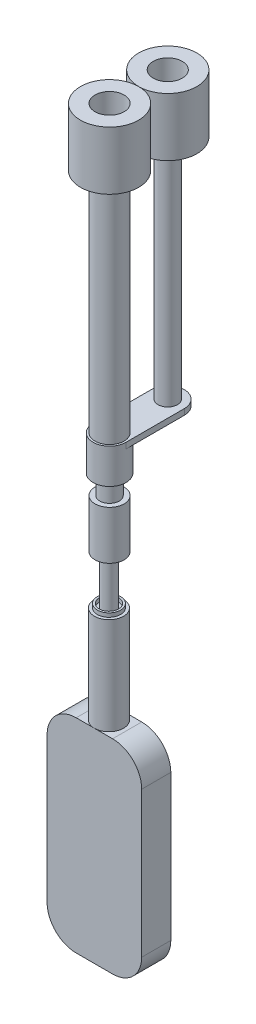
ISO-10303-21;
HEADER;
FILE_DESCRIPTION(('STEP AP214'),'2;1');
FILE_NAME('part.step','',(''),(''),'','','');
FILE_SCHEMA(('AUTOMOTIVE_DESIGN { 1 0 10303 214 1 1 1 1 }'));
ENDSEC;
DATA;
#1=APPLICATION_CONTEXT('core data for automotive mechanical design processes');
#2=APPLICATION_PROTOCOL_DEFINITION('international standard','automotive_design',2000,#1);
#3=PRODUCT_CONTEXT('',#1,'mechanical');
#4=PRODUCT('Part','Part','',(#3));
#5=PRODUCT_RELATED_PRODUCT_CATEGORY('part','',(#4));
#6=PRODUCT_DEFINITION_FORMATION('','',#4);
#7=PRODUCT_DEFINITION_CONTEXT('part definition',#1,'design');
#8=PRODUCT_DEFINITION('design','',#6,#7);
#9=PRODUCT_DEFINITION_SHAPE('','',#8);
#10=(LENGTH_UNIT() NAMED_UNIT(*) SI_UNIT(.MILLI.,.METRE.));
#11=(NAMED_UNIT(*) PLANE_ANGLE_UNIT() SI_UNIT($,.RADIAN.));
#12=(NAMED_UNIT(*) SI_UNIT($,.STERADIAN.) SOLID_ANGLE_UNIT());
#13=UNCERTAINTY_MEASURE_WITH_UNIT(LENGTH_MEASURE(1.E-05),#10,'distance_accuracy_value','');
#14=(GEOMETRIC_REPRESENTATION_CONTEXT(3) GLOBAL_UNCERTAINTY_ASSIGNED_CONTEXT((#13)) GLOBAL_UNIT_ASSIGNED_CONTEXT((#10,
#11,#12)) REPRESENTATION_CONTEXT('',''));
#15=CARTESIAN_POINT('',(0.,0.,0.));
#16=DIRECTION('',(0.,0.,1.));
#17=DIRECTION('',(1.,0.,0.));
#18=AXIS2_PLACEMENT_3D('',#15,#16,#17);
#19=CARTESIAN_POINT('',(0.,327.5,0.));
#20=DIRECTION('',(0.,1.,0.));
#21=DIRECTION('',(0.,0.,-1.));
#22=AXIS2_PLACEMENT_3D('',#19,#20,#21);
#23=PLANE('',#22);
#24=CARTESIAN_POINT('',(0.,327.5,-35.3070978727305));
#25=DIRECTION('',(0.,-1.,0.));
#26=DIRECTION('',(0.,0.,-1.));
#27=AXIS2_PLACEMENT_3D('',#24,#25,#26);
#28=CIRCLE('',#27,7.5);
#29=CARTESIAN_POINT('',(0.,327.5,-42.8070978727305));
#30=VERTEX_POINT('',#29);
#31=EDGE_CURVE('E59',#30,#30,#28,.T.);
#32=ORIENTED_EDGE('',*,*,#31,.T.);
#33=EDGE_LOOP('',(#32));
#34=FACE_BOUND('',#33,.T.);
#35=CARTESIAN_POINT('',(0.,327.5,-35.3070978727305));
#36=DIRECTION('',(0.,-1.,0.));
#37=DIRECTION('',(0.,0.,-1.));
#38=AXIS2_PLACEMENT_3D('',#35,#36,#37);
#39=CIRCLE('',#38,15.);
#40=CARTESIAN_POINT('',(0.,327.5,-50.3070978727305));
#41=VERTEX_POINT('',#40);
#42=EDGE_CURVE('E11',#41,#41,#39,.T.);
#43=ORIENTED_EDGE('',*,*,#42,.F.);
#44=EDGE_LOOP('',(#43));
#45=FACE_BOUND('',#44,.T.);
#46=ADVANCED_FACE('F46',(#34,#45),#23,.T.);
#47=CARTESIAN_POINT('',(0.,327.5,-35.3070978727305));
#48=DIRECTION('',(0.,-1.,0.));
#49=DIRECTION('',(1.,0.,0.));
#50=AXIS2_PLACEMENT_3D('',#47,#48,#49);
#51=CYLINDRICAL_SURFACE('',#50,15.);
#52=CARTESIAN_POINT('',(0.,297.5,-35.3070978727305));
#53=DIRECTION('',(0.,-1.,0.));
#54=DIRECTION('',(0.,0.,-1.));
#55=AXIS2_PLACEMENT_3D('',#52,#53,#54);
#56=CIRCLE('',#55,15.);
#57=CARTESIAN_POINT('',(0.,297.5,-50.3070978727305));
#58=VERTEX_POINT('',#57);
#59=EDGE_CURVE('E50',#58,#58,#56,.T.);
#60=ORIENTED_EDGE('',*,*,#59,.F.);
#61=EDGE_LOOP('',(#60));
#62=FACE_BOUND('',#61,.T.);
#63=ORIENTED_EDGE('',*,*,#42,.T.);
#64=EDGE_LOOP('',(#63));
#65=FACE_BOUND('',#64,.T.);
#66=ADVANCED_FACE('F48',(#62,#65),#51,.T.);
#67=CARTESIAN_POINT('',(0.,297.5,0.));
#68=DIRECTION('',(0.,1.,0.));
#69=DIRECTION('',(0.,0.,-1.));
#70=AXIS2_PLACEMENT_3D('',#67,#68,#69);
#71=PLANE('',#70);
#72=CARTESIAN_POINT('',(0.,297.5,-35.3070978727305));
#73=DIRECTION('',(0.,-1.,0.));
#74=DIRECTION('',(0.,0.,-1.));
#75=AXIS2_PLACEMENT_3D('',#72,#73,#74);
#76=CIRCLE('',#75,7.5);
#77=CARTESIAN_POINT('',(0.,297.5,-42.8070978727305));
#78=VERTEX_POINT('',#77);
#79=EDGE_CURVE('E57',#78,#78,#76,.T.);
#80=ORIENTED_EDGE('',*,*,#79,.F.);
#81=EDGE_LOOP('',(#80));
#82=FACE_BOUND('',#81,.T.);
#83=ORIENTED_EDGE('',*,*,#59,.T.);
#84=EDGE_LOOP('',(#83));
#85=FACE_BOUND('',#84,.T.);
#86=ADVANCED_FACE('F68',(#82,#85),#71,.F.);
#87=CARTESIAN_POINT('',(0.,297.5,-35.3070978727305));
#88=DIRECTION('',(0.,1.,0.));
#89=DIRECTION('',(0.,0.,-1.));
#90=AXIS2_PLACEMENT_3D('',#87,#88,#89);
#91=CYLINDRICAL_SURFACE('',#90,7.5);
#92=ORIENTED_EDGE('',*,*,#79,.T.);
#93=EDGE_LOOP('',(#92));
#94=FACE_BOUND('',#93,.T.);
#95=ORIENTED_EDGE('',*,*,#31,.F.);
#96=EDGE_LOOP('',(#95));
#97=FACE_BOUND('',#96,.T.);
#98=ADVANCED_FACE('F65',(#94,#97),#91,.F.);
#99=CLOSED_SHELL('',(#46,#66,#86,#98));
#100=MANIFOLD_SOLID_BREP('B2',#99);
#101=CARTESIAN_POINT('',(0.,102.5,-5.));
#102=DIRECTION('',(0.,1.,0.));
#103=DIRECTION('',(-1.,0.,0.));
#104=AXIS2_PLACEMENT_3D('',#101,#102,#103);
#105=PLANE('',#104);
#106=CARTESIAN_POINT('',(0.,102.5,-5.));
#107=DIRECTION('',(0.,-1.,0.));
#108=DIRECTION('',(-1.,0.,0.));
#109=AXIS2_PLACEMENT_3D('',#106,#107,#108);
#110=CIRCLE('',#109,3.5);
#111=CARTESIAN_POINT('',(-3.50000000000002,102.5,-5.));
#112=VERTEX_POINT('',#111);
#113=EDGE_CURVE('E323',#112,#112,#110,.T.);
#114=ORIENTED_EDGE('',*,*,#113,.T.);
#115=EDGE_LOOP('',(#114));
#116=FACE_BOUND('',#115,.T.);
#117=CARTESIAN_POINT('',(0.,102.5,-5.));
#118=DIRECTION('',(0.,-1.,0.));
#119=DIRECTION('',(-1.,0.,0.));
#120=AXIS2_PLACEMENT_3D('',#117,#118,#119);
#121=CIRCLE('',#120,5.);
#122=CARTESIAN_POINT('',(-5.00000000000002,102.5,-5.));
#123=VERTEX_POINT('',#122);
#124=EDGE_CURVE('E247',#123,#123,#121,.F.);
#125=ORIENTED_EDGE('',*,*,#124,.T.);
#126=EDGE_LOOP('',(#125));
#127=FACE_BOUND('',#126,.T.);
#128=ADVANCED_FACE('F115',(#116,#127),#105,.T.);
#129=CARTESIAN_POINT('',(0.,127.5,-5.));
#130=DIRECTION('',(0.,-1.,0.));
#131=DIRECTION('',(1.,0.,0.));
#132=AXIS2_PLACEMENT_3D('',#129,#130,#131);
#133=CYLINDRICAL_SURFACE('',#132,3.5);
#134=CARTESIAN_POINT('',(0.,127.5,-5.));
#135=DIRECTION('',(0.,-1.,0.));
#136=DIRECTION('',(-1.,0.,0.));
#137=AXIS2_PLACEMENT_3D('',#134,#135,#136);
#138=CIRCLE('',#137,3.5);
#139=CARTESIAN_POINT('',(-3.50000000000003,127.5,-5.));
#140=VERTEX_POINT('',#139);
#141=EDGE_CURVE('E327',#140,#140,#138,.T.);
#142=ORIENTED_EDGE('',*,*,#141,.T.);
#143=EDGE_LOOP('',(#142));
#144=FACE_BOUND('',#143,.T.);
#145=ORIENTED_EDGE('',*,*,#113,.F.);
#146=EDGE_LOOP('',(#145));
#147=FACE_BOUND('',#146,.T.);
#148=ADVANCED_FACE('F380',(#144,#147),#133,.T.);
#149=CARTESIAN_POINT('',(0.,152.5,-5.30709787273054));
#150=DIRECTION('',(0.,-1.,0.));
#151=DIRECTION('',(1.,0.,0.));
#152=AXIS2_PLACEMENT_3D('',#149,#150,#151);
#153=CYLINDRICAL_SURFACE('',#152,7.5);
#154=CARTESIAN_POINT('',(0.,152.5,-5.30709787273054));
#155=DIRECTION('',(0.,-1.,0.));
#156=DIRECTION('',(-1.,0.,0.));
#157=AXIS2_PLACEMENT_3D('',#154,#155,#156);
#158=CIRCLE('',#157,7.5);
#159=CARTESIAN_POINT('',(-7.50000000000003,152.5,-5.30709787273054));
#160=VERTEX_POINT('',#159);
#161=EDGE_CURVE('E331',#160,#160,#158,.T.);
#162=ORIENTED_EDGE('',*,*,#161,.T.);
#163=EDGE_LOOP('',(#162));
#164=FACE_BOUND('',#163,.T.);
#165=CARTESIAN_POINT('',(0.,127.5,-5.30709787273054));
#166=DIRECTION('',(0.,-1.,0.));
#167=DIRECTION('',(-1.,0.,0.));
#168=AXIS2_PLACEMENT_3D('',#165,#166,#167);
#169=CIRCLE('',#168,7.5);
#170=CARTESIAN_POINT('',(-7.50000000000003,127.5,-5.30709787273054));
#171=VERTEX_POINT('',#170);
#172=EDGE_CURVE('E326',#171,#171,#169,.T.);
#173=ORIENTED_EDGE('',*,*,#172,.F.);
#174=EDGE_LOOP('',(#173));
#175=FACE_BOUND('',#174,.T.);
#176=ADVANCED_FACE('F387',(#164,#175),#153,.T.);
#177=CARTESIAN_POINT('',(0.,152.5,-5.30709787273054));
#178=DIRECTION('',(0.,1.,0.));
#179=DIRECTION('',(-1.,0.,0.));
#180=AXIS2_PLACEMENT_3D('',#177,#178,#179);
#181=PLANE('',#180);
#182=CARTESIAN_POINT('',(0.,152.5,-5.30709787273054));
#183=DIRECTION('',(0.,-1.,0.));
#184=DIRECTION('',(-1.,0.,0.));
#185=AXIS2_PLACEMENT_3D('',#182,#183,#184);
#186=CIRCLE('',#185,5.);
#187=CARTESIAN_POINT('',(-5.00000000000003,152.5,-5.30709787273054));
#188=VERTEX_POINT('',#187);
#189=EDGE_CURVE('E330',#188,#188,#186,.T.);
#190=ORIENTED_EDGE('',*,*,#189,.T.);
#191=EDGE_LOOP('',(#190));
#192=FACE_BOUND('',#191,.T.);
#193=ORIENTED_EDGE('',*,*,#161,.F.);
#194=EDGE_LOOP('',(#193));
#195=FACE_BOUND('',#194,.T.);
#196=ADVANCED_FACE('F660',(#192,#195),#181,.T.);
#197=CARTESIAN_POINT('',(0.,127.5,-5.30709787273054));
#198=DIRECTION('',(0.,1.,0.));
#199=DIRECTION('',(-1.,0.,0.));
#200=AXIS2_PLACEMENT_3D('',#197,#198,#199);
#201=PLANE('',#200);
#202=ORIENTED_EDGE('',*,*,#141,.F.);
#203=EDGE_LOOP('',(#202));
#204=FACE_BOUND('',#203,.T.);
#205=ORIENTED_EDGE('',*,*,#172,.T.);
#206=EDGE_LOOP('',(#205));
#207=FACE_BOUND('',#206,.T.);
#208=ADVANCED_FACE('F652',(#204,#207),#201,.F.);
#209=CARTESIAN_POINT('',(0.,162.5,-5.30709787273054));
#210=DIRECTION('',(0.,-1.,0.));
#211=DIRECTION('',(1.,0.,0.));
#212=AXIS2_PLACEMENT_3D('',#209,#210,#211);
#213=CYLINDRICAL_SURFACE('',#212,5.);
#214=CARTESIAN_POINT('',(0.,162.5,-5.30709787273054));
#215=DIRECTION('',(0.,-1.,0.));
#216=DIRECTION('',(-1.,0.,0.));
#217=AXIS2_PLACEMENT_3D('',#214,#215,#216);
#218=CIRCLE('',#217,5.);
#219=CARTESIAN_POINT('',(-5.00000000000003,162.5,-5.30709787273054));
#220=VERTEX_POINT('',#219);
#221=EDGE_CURVE('E339',#220,#220,#218,.T.);
#222=ORIENTED_EDGE('',*,*,#221,.T.);
#223=EDGE_LOOP('',(#222));
#224=FACE_BOUND('',#223,.T.);
#225=ORIENTED_EDGE('',*,*,#189,.F.);
#226=EDGE_LOOP('',(#225));
#227=FACE_BOUND('',#226,.T.);
#228=ADVANCED_FACE('F646',(#224,#227),#213,.T.);
#229=CARTESIAN_POINT('',(0.,177.5,-5.30709787273054));
#230=DIRECTION('',(0.,-1.,0.));
#231=DIRECTION('',(1.,0.,0.));
#232=AXIS2_PLACEMENT_3D('',#229,#230,#231);
#233=CYLINDRICAL_SURFACE('',#232,8.5);
#234=CARTESIAN_POINT('',(0.,177.5,-5.30709787273054));
#235=DIRECTION('',(0.,-1.,0.));
#236=DIRECTION('',(-1.,0.,0.));
#237=AXIS2_PLACEMENT_3D('',#234,#235,#236);
#238=CIRCLE('',#237,8.5);
#239=CARTESIAN_POINT('',(-8.50000000000004,177.5,-5.30709787273054));
#240=VERTEX_POINT('',#239);
#241=CARTESIAN_POINT('',(8.49999999999996,177.5,-5.30709787273052));
#242=VERTEX_POINT('',#241);
#243=EDGE_CURVE('E244',#240,#242,#238,.T.);
#244=ORIENTED_EDGE('',*,*,#243,.T.);
#245=DIRECTION('',(0.,-1.,0.));
#246=VECTOR('',#245,1.);
#247=CARTESIAN_POINT('',(8.49999999999996,180.5,-5.30709787273054));
#248=LINE('',#247,#246);
#249=CARTESIAN_POINT('',(8.49999999999996,180.5,-5.30709787273054));
#250=VERTEX_POINT('',#249);
#251=EDGE_CURVE('E338',#250,#242,#248,.T.);
#252=ORIENTED_EDGE('',*,*,#251,.F.);
#253=CARTESIAN_POINT('',(0.,180.5,-5.30709787273054));
#254=DIRECTION('',(0.,-1.,0.));
#255=DIRECTION('',(0.,0.,-1.));
#256=AXIS2_PLACEMENT_3D('',#253,#254,#255);
#257=CIRCLE('',#256,8.5);
#258=CARTESIAN_POINT('',(-8.50000000000004,180.5,-5.30709787273054));
#259=VERTEX_POINT('',#258);
#260=EDGE_CURVE('E229',#250,#259,#257,.T.);
#261=ORIENTED_EDGE('',*,*,#260,.T.);
#262=DIRECTION('',(0.,-1.,0.));
#263=VECTOR('',#262,1.);
#264=CARTESIAN_POINT('',(-8.50000000000004,180.5,-5.30709787273054));
#265=LINE('',#264,#263);
#266=EDGE_CURVE('E227',#259,#240,#265,.T.);
#267=ORIENTED_EDGE('',*,*,#266,.T.);
#268=EDGE_LOOP('',(#244,#252,#261,#267));
#269=FACE_BOUND('',#268,.T.);
#270=CARTESIAN_POINT('',(0.,162.5,-5.30709787273054));
#271=DIRECTION('',(0.,-1.,0.));
#272=DIRECTION('',(-1.,0.,0.));
#273=AXIS2_PLACEMENT_3D('',#270,#271,#272);
#274=CIRCLE('',#273,8.5);
#275=CARTESIAN_POINT('',(-8.50000000000004,162.5,-5.30709787273054));
#276=VERTEX_POINT('',#275);
#277=EDGE_CURVE('E343',#276,#276,#274,.T.);
#278=ORIENTED_EDGE('',*,*,#277,.F.);
#279=EDGE_LOOP('',(#278));
#280=FACE_BOUND('',#279,.T.);
#281=ADVANCED_FACE('F364',(#269,#280),#233,.T.);
#282=CARTESIAN_POINT('',(0.,162.5,-5.30709787273054));
#283=DIRECTION('',(0.,1.,0.));
#284=DIRECTION('',(-1.,0.,0.));
#285=AXIS2_PLACEMENT_3D('',#282,#283,#284);
#286=PLANE('',#285);
#287=ORIENTED_EDGE('',*,*,#221,.F.);
#288=EDGE_LOOP('',(#287));
#289=FACE_BOUND('',#288,.T.);
#290=ORIENTED_EDGE('',*,*,#277,.T.);
#291=EDGE_LOOP('',(#290));
#292=FACE_BOUND('',#291,.T.);
#293=ADVANCED_FACE('F608',(#289,#292),#286,.F.);
#294=CARTESIAN_POINT('',(0.,104.5,-5.));
#295=DIRECTION('',(0.,1.,0.));
#296=DIRECTION('',(-1.,0.,0.));
#297=AXIS2_PLACEMENT_3D('',#294,#295,#296);
#298=PLANE('',#297);
#299=CARTESIAN_POINT('',(0.,104.5,-5.));
#300=DIRECTION('',(0.,-1.,0.));
#301=DIRECTION('',(-1.,0.,0.));
#302=AXIS2_PLACEMENT_3D('',#299,#300,#301);
#303=CIRCLE('',#302,6.);
#304=CARTESIAN_POINT('',(-6.00000000000002,104.5,-5.));
#305=VERTEX_POINT('',#304);
#306=EDGE_CURVE('E342',#305,#305,#303,.T.);
#307=ORIENTED_EDGE('',*,*,#306,.F.);
#308=EDGE_LOOP('',(#307));
#309=FACE_BOUND('',#308,.T.);
#310=CARTESIAN_POINT('',(0.,104.5,-5.));
#311=DIRECTION('',(0.,-1.,0.));
#312=DIRECTION('',(-1.,0.,0.));
#313=AXIS2_PLACEMENT_3D('',#310,#311,#312);
#314=CIRCLE('',#313,5.);
#315=CARTESIAN_POINT('',(-5.00000000000002,104.5,-5.));
#316=VERTEX_POINT('',#315);
#317=EDGE_CURVE('E251',#316,#316,#314,.T.);
#318=ORIENTED_EDGE('',*,*,#317,.T.);
#319=EDGE_LOOP('',(#318));
#320=FACE_BOUND('',#319,.T.);
#321=ADVANCED_FACE('F614',(#309,#320),#298,.T.);
#322=CARTESIAN_POINT('',(0.,104.5,-5.));
#323=DIRECTION('',(0.,-1.,0.));
#324=DIRECTION('',(1.,0.,0.));
#325=AXIS2_PLACEMENT_3D('',#322,#323,#324);
#326=CYLINDRICAL_SURFACE('',#325,6.);
#327=ORIENTED_EDGE('',*,*,#306,.T.);
#328=EDGE_LOOP('',(#327));
#329=FACE_BOUND('',#328,.T.);
#330=CARTESIAN_POINT('',(0.,102.5,-5.));
#331=DIRECTION('',(0.,-1.,0.));
#332=DIRECTION('',(-1.,0.,0.));
#333=AXIS2_PLACEMENT_3D('',#330,#331,#332);
#334=CIRCLE('',#333,6.);
#335=CARTESIAN_POINT('',(-6.00000000000002,102.5,-5.));
#336=VERTEX_POINT('',#335);
#337=EDGE_CURVE('E348',#336,#336,#334,.T.);
#338=ORIENTED_EDGE('',*,*,#337,.F.);
#339=EDGE_LOOP('',(#338));
#340=FACE_BOUND('',#339,.T.);
#341=ADVANCED_FACE('F611',(#329,#340),#326,.T.);
#342=CARTESIAN_POINT('',(0.,104.5,-5.));
#343=DIRECTION('',(0.,-1.,0.));
#344=DIRECTION('',(1.,0.,0.));
#345=AXIS2_PLACEMENT_3D('',#342,#343,#344);
#346=CYLINDRICAL_SURFACE('',#345,5.);
#347=ORIENTED_EDGE('',*,*,#317,.F.);
#348=EDGE_LOOP('',(#347));
#349=FACE_BOUND('',#348,.T.);
#350=ORIENTED_EDGE('',*,*,#124,.F.);
#351=EDGE_LOOP('',(#350));
#352=FACE_BOUND('',#351,.T.);
#353=ADVANCED_FACE('F464',(#349,#352),#346,.F.);
#354=CARTESIAN_POINT('',(24.375,52.5,-12.5));
#355=DIRECTION('',(-1.,0.,0.));
#356=DIRECTION('',(0.,-1.,0.));
#357=AXIS2_PLACEMENT_3D('',#354,#355,#356);
#358=PLANE('',#357);
#359=DIRECTION('',(0.,1.,0.));
#360=VECTOR('',#359,1.);
#361=CARTESIAN_POINT('',(24.375,52.5,-12.5));
#362=LINE('',#361,#360);
#363=CARTESIAN_POINT('',(24.375,-37.5,-12.5));
#364=VERTEX_POINT('',#363);
#365=CARTESIAN_POINT('',(24.375,37.5,-12.5));
#366=VERTEX_POINT('',#365);
#367=EDGE_CURVE('E272',#364,#366,#362,.T.);
#368=ORIENTED_EDGE('',*,*,#367,.T.);
#369=DIRECTION('',(0.,0.,1.));
#370=VECTOR('',#369,1.);
#371=CARTESIAN_POINT('',(24.375,37.5,-12.5));
#372=LINE('',#371,#370);
#373=CARTESIAN_POINT('',(24.375,37.5,2.5));
#374=VERTEX_POINT('',#373);
#375=EDGE_CURVE('E262',#374,#366,#372,.F.);
#376=ORIENTED_EDGE('',*,*,#375,.F.);
#377=DIRECTION('',(0.,1.,0.));
#378=VECTOR('',#377,1.);
#379=CARTESIAN_POINT('',(24.375,52.5,2.5));
#380=LINE('',#379,#378);
#381=CARTESIAN_POINT('',(24.375,-37.5,2.5));
#382=VERTEX_POINT('',#381);
#383=EDGE_CURVE('E261',#382,#374,#380,.T.);
#384=ORIENTED_EDGE('',*,*,#383,.F.);
#385=DIRECTION('',(0.,0.,1.));
#386=VECTOR('',#385,1.);
#387=CARTESIAN_POINT('',(24.375,-37.5,-12.5));
#388=LINE('',#387,#386);
#389=EDGE_CURVE('E250',#364,#382,#388,.T.);
#390=ORIENTED_EDGE('',*,*,#389,.F.);
#391=EDGE_LOOP('',(#368,#376,#384,#390));
#392=FACE_BOUND('',#391,.T.);
#393=ADVANCED_FACE('F438',(#392),#358,.F.);
#394=CARTESIAN_POINT('',(9.37500000000001,-37.5,-12.5));
#395=DIRECTION('',(0.,0.,1.));
#396=DIRECTION('',(-1.,0.,0.));
#397=AXIS2_PLACEMENT_3D('',#394,#395,#396);
#398=CYLINDRICAL_SURFACE('',#397,15.);
#399=CARTESIAN_POINT('',(9.37500000000001,-37.5,-12.5));
#400=DIRECTION('',(0.,0.,-1.));
#401=DIRECTION('',(-1.,0.,0.));
#402=AXIS2_PLACEMENT_3D('',#399,#400,#401);
#403=CIRCLE('',#402,15.);
#404=CARTESIAN_POINT('',(9.37500000000001,-52.5,-12.5));
#405=VERTEX_POINT('',#404);
#406=EDGE_CURVE('E270',#405,#364,#403,.F.);
#407=ORIENTED_EDGE('',*,*,#406,.T.);
#408=ORIENTED_EDGE('',*,*,#389,.T.);
#409=CARTESIAN_POINT('',(9.37500000000001,-37.5,2.5));
#410=DIRECTION('',(0.,0.,-1.));
#411=DIRECTION('',(-1.,0.,0.));
#412=AXIS2_PLACEMENT_3D('',#409,#410,#411);
#413=CIRCLE('',#412,15.);
#414=CARTESIAN_POINT('',(9.37500000000001,-52.5,2.5));
#415=VERTEX_POINT('',#414);
#416=EDGE_CURVE('E291',#382,#415,#413,.T.);
#417=ORIENTED_EDGE('',*,*,#416,.T.);
#418=DIRECTION('',(0.,0.,1.));
#419=VECTOR('',#418,1.);
#420=CARTESIAN_POINT('',(9.37500000000001,-52.5,-12.5));
#421=LINE('',#420,#419);
#422=EDGE_CURVE('E301',#415,#405,#421,.F.);
#423=ORIENTED_EDGE('',*,*,#422,.T.);
#424=EDGE_LOOP('',(#407,#408,#417,#423));
#425=FACE_BOUND('',#424,.T.);
#426=ADVANCED_FACE('F440',(#425),#398,.T.);
#427=CARTESIAN_POINT('',(24.375,-52.5,-12.5));
#428=DIRECTION('',(0.,1.,0.));
#429=DIRECTION('',(-1.,0.,0.));
#430=AXIS2_PLACEMENT_3D('',#427,#428,#429);
#431=PLANE('',#430);
#432=DIRECTION('',(1.,0.,0.));
#433=VECTOR('',#432,1.);
#434=CARTESIAN_POINT('',(24.375,-52.5,-12.5));
#435=LINE('',#434,#433);
#436=CARTESIAN_POINT('',(-9.37499999999999,-52.5,-12.5));
#437=VERTEX_POINT('',#436);
#438=EDGE_CURVE('E268',#437,#405,#435,.T.);
#439=ORIENTED_EDGE('',*,*,#438,.T.);
#440=ORIENTED_EDGE('',*,*,#422,.F.);
#441=DIRECTION('',(1.,0.,0.));
#442=VECTOR('',#441,1.);
#443=CARTESIAN_POINT('',(24.375,-52.5,2.5));
#444=LINE('',#443,#442);
#445=CARTESIAN_POINT('',(-9.37499999999999,-52.5,2.5));
#446=VERTEX_POINT('',#445);
#447=EDGE_CURVE('E300',#446,#415,#444,.T.);
#448=ORIENTED_EDGE('',*,*,#447,.F.);
#449=DIRECTION('',(0.,0.,1.));
#450=VECTOR('',#449,1.);
#451=CARTESIAN_POINT('',(-9.37499999999999,-52.5,-12.5));
#452=LINE('',#451,#450);
#453=EDGE_CURVE('E265',#437,#446,#452,.T.);
#454=ORIENTED_EDGE('',*,*,#453,.F.);
#455=EDGE_LOOP('',(#439,#440,#448,#454));
#456=FACE_BOUND('',#455,.T.);
#457=ADVANCED_FACE('F444',(#456),#431,.F.);
#458=CARTESIAN_POINT('',(-9.37499999999999,-37.5,-12.5));
#459=DIRECTION('',(0.,0.,1.));
#460=DIRECTION('',(-1.,0.,0.));
#461=AXIS2_PLACEMENT_3D('',#458,#459,#460);
#462=CYLINDRICAL_SURFACE('',#461,15.);
#463=CARTESIAN_POINT('',(-9.37499999999999,-37.5,-12.5));
#464=DIRECTION('',(0.,0.,-1.));
#465=DIRECTION('',(-1.,0.,0.));
#466=AXIS2_PLACEMENT_3D('',#463,#464,#465);
#467=CIRCLE('',#466,15.);
#468=CARTESIAN_POINT('',(-24.375,-37.5,-12.5));
#469=VERTEX_POINT('',#468);
#470=EDGE_CURVE('E266',#469,#437,#467,.F.);
#471=ORIENTED_EDGE('',*,*,#470,.T.);
#472=ORIENTED_EDGE('',*,*,#453,.T.);
#473=CARTESIAN_POINT('',(-9.37499999999999,-37.5,2.5));
#474=DIRECTION('',(0.,0.,-1.));
#475=DIRECTION('',(-1.,0.,0.));
#476=AXIS2_PLACEMENT_3D('',#473,#474,#475);
#477=CIRCLE('',#476,15.);
#478=CARTESIAN_POINT('',(-24.375,-37.5,2.5));
#479=VERTEX_POINT('',#478);
#480=EDGE_CURVE('E287',#446,#479,#477,.T.);
#481=ORIENTED_EDGE('',*,*,#480,.T.);
#482=DIRECTION('',(0.,0.,1.));
#483=VECTOR('',#482,1.);
#484=CARTESIAN_POINT('',(-24.375,-37.5,-12.5));
#485=LINE('',#484,#483);
#486=EDGE_CURVE('E280',#479,#469,#485,.F.);
#487=ORIENTED_EDGE('',*,*,#486,.T.);
#488=EDGE_LOOP('',(#471,#472,#481,#487));
#489=FACE_BOUND('',#488,.T.);
#490=ADVANCED_FACE('F447',(#489),#462,.T.);
#491=CARTESIAN_POINT('',(-24.375,52.5,-12.5));
#492=DIRECTION('',(1.,0.,0.));
#493=DIRECTION('',(0.,1.,0.));
#494=AXIS2_PLACEMENT_3D('',#491,#492,#493);
#495=PLANE('',#494);
#496=DIRECTION('',(0.,-1.,0.));
#497=VECTOR('',#496,1.);
#498=CARTESIAN_POINT('',(-24.375,52.5,2.5));
#499=LINE('',#498,#497);
#500=CARTESIAN_POINT('',(-24.375,37.5,2.5));
#501=VERTEX_POINT('',#500);
#502=EDGE_CURVE('E284',#501,#479,#499,.T.);
#503=ORIENTED_EDGE('',*,*,#502,.F.);
#504=DIRECTION('',(0.,0.,1.));
#505=VECTOR('',#504,1.);
#506=CARTESIAN_POINT('',(-24.375,37.5,-12.5));
#507=LINE('',#506,#505);
#508=CARTESIAN_POINT('',(-24.375,37.5,-12.5));
#509=VERTEX_POINT('',#508);
#510=EDGE_CURVE('E283',#509,#501,#507,.T.);
#511=ORIENTED_EDGE('',*,*,#510,.F.);
#512=DIRECTION('',(0.,-1.,0.));
#513=VECTOR('',#512,1.);
#514=CARTESIAN_POINT('',(-24.375,52.5,-12.5));
#515=LINE('',#514,#513);
#516=EDGE_CURVE('E269',#509,#469,#515,.T.);
#517=ORIENTED_EDGE('',*,*,#516,.T.);
#518=ORIENTED_EDGE('',*,*,#486,.F.);
#519=EDGE_LOOP('',(#503,#511,#517,#518));
#520=FACE_BOUND('',#519,.T.);
#521=ADVANCED_FACE('F449',(#520),#495,.F.);
#522=CARTESIAN_POINT('',(-9.37499999999999,37.5,-12.5));
#523=DIRECTION('',(0.,0.,1.));
#524=DIRECTION('',(-1.,0.,0.));
#525=AXIS2_PLACEMENT_3D('',#522,#523,#524);
#526=CYLINDRICAL_SURFACE('',#525,15.);
#527=CARTESIAN_POINT('',(-9.37499999999999,37.5,-12.5));
#528=DIRECTION('',(0.,0.,-1.));
#529=DIRECTION('',(-1.,0.,0.));
#530=AXIS2_PLACEMENT_3D('',#527,#528,#529);
#531=CIRCLE('',#530,15.);
#532=CARTESIAN_POINT('',(-9.375,52.5,-12.5));
#533=VERTEX_POINT('',#532);
#534=EDGE_CURVE('E277',#533,#509,#531,.F.);
#535=ORIENTED_EDGE('',*,*,#534,.T.);
#536=ORIENTED_EDGE('',*,*,#510,.T.);
#537=CARTESIAN_POINT('',(-9.37499999999999,37.5,2.5));
#538=DIRECTION('',(0.,0.,-1.));
#539=DIRECTION('',(-1.,0.,0.));
#540=AXIS2_PLACEMENT_3D('',#537,#538,#539);
#541=CIRCLE('',#540,15.);
#542=CARTESIAN_POINT('',(-9.375,52.5,2.5));
#543=VERTEX_POINT('',#542);
#544=EDGE_CURVE('E290',#501,#543,#541,.T.);
#545=ORIENTED_EDGE('',*,*,#544,.T.);
#546=DIRECTION('',(0.,0.,1.));
#547=VECTOR('',#546,1.);
#548=CARTESIAN_POINT('',(-9.375,52.5,-12.5));
#549=LINE('',#548,#547);
#550=EDGE_CURVE('E255',#543,#533,#549,.F.);
#551=ORIENTED_EDGE('',*,*,#550,.T.);
#552=EDGE_LOOP('',(#535,#536,#545,#551));
#553=FACE_BOUND('',#552,.T.);
#554=ADVANCED_FACE('F423',(#553),#526,.T.);
#555=CARTESIAN_POINT('',(0.,0.,2.5));
#556=DIRECTION('',(0.,0.,1.));
#557=DIRECTION('',(-1.,0.,0.));
#558=AXIS2_PLACEMENT_3D('',#555,#556,#557);
#559=PLANE('',#558);
#560=ORIENTED_EDGE('',*,*,#447,.T.);
#561=ORIENTED_EDGE('',*,*,#416,.F.);
#562=ORIENTED_EDGE('',*,*,#383,.T.);
#563=CARTESIAN_POINT('',(9.375,37.5,2.5));
#564=DIRECTION('',(0.,0.,-1.));
#565=DIRECTION('',(-1.,0.,0.));
#566=AXIS2_PLACEMENT_3D('',#563,#564,#565);
#567=CIRCLE('',#566,15.);
#568=CARTESIAN_POINT('',(9.375,52.5,2.5));
#569=VERTEX_POINT('',#568);
#570=EDGE_CURVE('E294',#569,#374,#567,.T.);
#571=ORIENTED_EDGE('',*,*,#570,.F.);
#572=DIRECTION('',(-1.,0.,0.));
#573=VECTOR('',#572,1.);
#574=CARTESIAN_POINT('',(24.375,52.5,2.5));
#575=LINE('',#574,#573);
#576=CARTESIAN_POINT('',(0.,52.5,2.5));
#577=VERTEX_POINT('',#576);
#578=EDGE_CURVE('E254',#569,#577,#575,.T.);
#579=ORIENTED_EDGE('',*,*,#578,.T.);
#580=EDGE_CURVE('E258',#577,#543,#575,.T.);
#581=ORIENTED_EDGE('',*,*,#580,.T.);
#582=ORIENTED_EDGE('',*,*,#544,.F.);
#583=ORIENTED_EDGE('',*,*,#502,.T.);
#584=ORIENTED_EDGE('',*,*,#480,.F.);
#585=EDGE_LOOP('',(#560,#561,#562,#571,#579,#581,#582,#583,#584));
#586=FACE_BOUND('',#585,.T.);
#587=ADVANCED_FACE('F426',(#586),#559,.T.);
#588=CARTESIAN_POINT('',(9.375,37.5,-12.5));
#589=DIRECTION('',(0.,0.,1.));
#590=DIRECTION('',(-1.,0.,0.));
#591=AXIS2_PLACEMENT_3D('',#588,#589,#590);
#592=CYLINDRICAL_SURFACE('',#591,15.);
#593=CARTESIAN_POINT('',(9.375,37.5,-12.5));
#594=DIRECTION('',(0.,0.,-1.));
#595=DIRECTION('',(-1.,0.,0.));
#596=AXIS2_PLACEMENT_3D('',#593,#594,#595);
#597=CIRCLE('',#596,15.);
#598=CARTESIAN_POINT('',(9.375,52.5,-12.5));
#599=VERTEX_POINT('',#598);
#600=EDGE_CURVE('E273',#366,#599,#597,.F.);
#601=ORIENTED_EDGE('',*,*,#600,.T.);
#602=DIRECTION('',(0.,0.,1.));
#603=VECTOR('',#602,1.);
#604=CARTESIAN_POINT('',(9.375,52.5,-12.5));
#605=LINE('',#604,#603);
#606=EDGE_CURVE('E252',#599,#569,#605,.T.);
#607=ORIENTED_EDGE('',*,*,#606,.T.);
#608=ORIENTED_EDGE('',*,*,#570,.T.);
#609=ORIENTED_EDGE('',*,*,#375,.T.);
#610=EDGE_LOOP('',(#601,#607,#608,#609));
#611=FACE_BOUND('',#610,.T.);
#612=ADVANCED_FACE('F432',(#611),#592,.T.);
#613=CARTESIAN_POINT('',(0.,0.,-12.5));
#614=DIRECTION('',(0.,0.,1.));
#615=DIRECTION('',(-1.,0.,0.));
#616=AXIS2_PLACEMENT_3D('',#613,#614,#615);
#617=PLANE('',#616);
#618=ORIENTED_EDGE('',*,*,#516,.F.);
#619=ORIENTED_EDGE('',*,*,#534,.F.);
#620=DIRECTION('',(-1.,0.,0.));
#621=VECTOR('',#620,1.);
#622=CARTESIAN_POINT('',(24.375,52.5,-12.5));
#623=LINE('',#622,#621);
#624=CARTESIAN_POINT('',(0.,52.5,-12.5));
#625=VERTEX_POINT('',#624);
#626=EDGE_CURVE('E279',#625,#533,#623,.T.);
#627=ORIENTED_EDGE('',*,*,#626,.F.);
#628=EDGE_CURVE('E276',#599,#625,#623,.T.);
#629=ORIENTED_EDGE('',*,*,#628,.F.);
#630=ORIENTED_EDGE('',*,*,#600,.F.);
#631=ORIENTED_EDGE('',*,*,#367,.F.);
#632=ORIENTED_EDGE('',*,*,#406,.F.);
#633=ORIENTED_EDGE('',*,*,#438,.F.);
#634=ORIENTED_EDGE('',*,*,#470,.F.);
#635=EDGE_LOOP('',(#618,#619,#627,#629,#630,#631,#632,#633,#634));
#636=FACE_BOUND('',#635,.T.);
#637=ADVANCED_FACE('F419',(#636),#617,.F.);
#638=CARTESIAN_POINT('',(24.375,52.5,-12.5));
#639=DIRECTION('',(0.,-1.,0.));
#640=DIRECTION('',(1.,0.,0.));
#641=AXIS2_PLACEMENT_3D('',#638,#639,#640);
#642=PLANE('',#641);
#643=CARTESIAN_POINT('',(0.,52.5,-5.));
#644=DIRECTION('',(0.,-1.,0.));
#645=DIRECTION('',(-1.,0.,0.));
#646=AXIS2_PLACEMENT_3D('',#643,#644,#645);
#647=CIRCLE('',#646,7.5);
#648=EDGE_CURVE('E318',#577,#625,#647,.T.);
#649=ORIENTED_EDGE('',*,*,#648,.T.);
#650=ORIENTED_EDGE('',*,*,#626,.T.);
#651=ORIENTED_EDGE('',*,*,#550,.F.);
#652=ORIENTED_EDGE('',*,*,#580,.F.);
#653=EDGE_LOOP('',(#649,#650,#651,#652));
#654=FACE_BOUND('',#653,.T.);
#655=ADVANCED_FACE('F412',(#654),#642,.F.);
#656=EDGE_CURVE('E306',#625,#577,#647,.T.);
#657=ORIENTED_EDGE('',*,*,#656,.T.);
#658=ORIENTED_EDGE('',*,*,#578,.F.);
#659=ORIENTED_EDGE('',*,*,#606,.F.);
#660=ORIENTED_EDGE('',*,*,#628,.T.);
#661=EDGE_LOOP('',(#657,#658,#659,#660));
#662=FACE_BOUND('',#661,.T.);
#663=ADVANCED_FACE('F400',(#662),#642,.F.);
#664=CARTESIAN_POINT('',(0.,102.5,-5.));
#665=DIRECTION('',(0.,-1.,0.));
#666=DIRECTION('',(1.,0.,0.));
#667=AXIS2_PLACEMENT_3D('',#664,#665,#666);
#668=CYLINDRICAL_SURFACE('',#667,7.5);
#669=CARTESIAN_POINT('',(0.,102.5,-5.));
#670=DIRECTION('',(0.,-1.,0.));
#671=DIRECTION('',(-1.,0.,0.));
#672=AXIS2_PLACEMENT_3D('',#669,#670,#671);
#673=CIRCLE('',#672,7.5);
#674=CARTESIAN_POINT('',(-7.50000000000002,102.5,-5.));
#675=VERTEX_POINT('',#674);
#676=EDGE_CURVE('E319',#675,#675,#673,.T.);
#677=ORIENTED_EDGE('',*,*,#676,.T.);
#678=EDGE_LOOP('',(#677));
#679=FACE_BOUND('',#678,.T.);
#680=ORIENTED_EDGE('',*,*,#656,.F.);
#681=ORIENTED_EDGE('',*,*,#648,.F.);
#682=EDGE_LOOP('',(#680,#681));
#683=FACE_BOUND('',#682,.T.);
#684=ADVANCED_FACE('F393',(#679,#683),#668,.T.);
#685=ORIENTED_EDGE('',*,*,#337,.T.);
#686=EDGE_LOOP('',(#685));
#687=FACE_BOUND('',#686,.T.);
#688=ORIENTED_EDGE('',*,*,#676,.F.);
#689=EDGE_LOOP('',(#688));
#690=FACE_BOUND('',#689,.T.);
#691=ADVANCED_FACE('F383',(#687,#690),#105,.T.);
#692=CARTESIAN_POINT('',(-8.50000000000004,180.5,-5.30709787273054));
#693=DIRECTION('',(1.,0.,0.));
#694=DIRECTION('',(0.,0.,1.));
#695=AXIS2_PLACEMENT_3D('',#692,#693,#694);
#696=PLANE('',#695);
#697=DIRECTION('',(0.,0.,-1.));
#698=VECTOR('',#697,1.);
#699=CARTESIAN_POINT('',(-8.50000000000004,177.5,-5.30709787273054));
#700=LINE('',#699,#698);
#701=CARTESIAN_POINT('',(-8.50000000000004,177.5,-35.3070978727305));
#702=VERTEX_POINT('',#701);
#703=EDGE_CURVE('E322',#240,#702,#700,.T.);
#704=ORIENTED_EDGE('',*,*,#703,.F.);
#705=ORIENTED_EDGE('',*,*,#266,.F.);
#706=DIRECTION('',(0.,0.,-1.));
#707=VECTOR('',#706,1.);
#708=CARTESIAN_POINT('',(-8.50000000000004,180.5,-5.30709787273054));
#709=LINE('',#708,#707);
#710=CARTESIAN_POINT('',(-8.50000000000004,180.5,-35.3070978727305));
#711=VERTEX_POINT('',#710);
#712=EDGE_CURVE('E211',#259,#711,#709,.T.);
#713=ORIENTED_EDGE('',*,*,#712,.T.);
#714=DIRECTION('',(0.,-1.,0.));
#715=VECTOR('',#714,1.);
#716=CARTESIAN_POINT('',(-8.50000000000004,180.5,-35.3070978727305));
#717=LINE('',#716,#715);
#718=EDGE_CURVE('E219',#711,#702,#717,.T.);
#719=ORIENTED_EDGE('',*,*,#718,.T.);
#720=EDGE_LOOP('',(#704,#705,#713,#719));
#721=FACE_BOUND('',#720,.T.);
#722=ADVANCED_FACE('F225',(#721),#696,.F.);
#723=CARTESIAN_POINT('',(0.,180.5,-35.3070978727305));
#724=DIRECTION('',(0.,-1.,0.));
#725=DIRECTION('',(0.,0.,1.));
#726=AXIS2_PLACEMENT_3D('',#723,#724,#725);
#727=CYLINDRICAL_SURFACE('',#726,8.50000000000004);
#728=CARTESIAN_POINT('',(0.,177.5,-35.3070978727305));
#729=DIRECTION('',(0.,-1.,0.));
#730=DIRECTION('',(0.,0.,-1.));
#731=AXIS2_PLACEMENT_3D('',#728,#729,#730);
#732=CIRCLE('',#731,8.50000000000004);
#733=CARTESIAN_POINT('',(8.50000000000004,177.5,-35.3070978727305));
#734=VERTEX_POINT('',#733);
#735=EDGE_CURVE('E221',#702,#734,#732,.T.);
#736=ORIENTED_EDGE('',*,*,#735,.F.);
#737=ORIENTED_EDGE('',*,*,#718,.F.);
#738=CARTESIAN_POINT('',(0.,180.5,-35.3070978727305));
#739=DIRECTION('',(0.,-1.,0.));
#740=DIRECTION('',(0.,0.,-1.));
#741=AXIS2_PLACEMENT_3D('',#738,#739,#740);
#742=CIRCLE('',#741,8.50000000000004);
#743=CARTESIAN_POINT('',(8.50000000000004,180.5,-35.3070978727305));
#744=VERTEX_POINT('',#743);
#745=EDGE_CURVE('E206',#711,#744,#742,.T.);
#746=ORIENTED_EDGE('',*,*,#745,.T.);
#747=DIRECTION('',(0.,-1.,0.));
#748=VECTOR('',#747,1.);
#749=CARTESIAN_POINT('',(8.50000000000004,180.5,-35.3070978727305));
#750=LINE('',#749,#748);
#751=EDGE_CURVE('E231',#744,#734,#750,.T.);
#752=ORIENTED_EDGE('',*,*,#751,.T.);
#753=EDGE_LOOP('',(#736,#737,#746,#752));
#754=FACE_BOUND('',#753,.T.);
#755=ADVANCED_FACE('F220',(#754),#727,.T.);
#756=CARTESIAN_POINT('',(8.49999999999996,180.5,-5.30709787273054));
#757=DIRECTION('',(-1.,0.,0.));
#758=DIRECTION('',(0.,0.,-1.));
#759=AXIS2_PLACEMENT_3D('',#756,#757,#758);
#760=PLANE('',#759);
#761=DIRECTION('',(0.,0.,1.));
#762=VECTOR('',#761,1.);
#763=CARTESIAN_POINT('',(8.49999999999996,177.5,-5.30709787273054));
#764=LINE('',#763,#762);
#765=EDGE_CURVE('E132',#734,#242,#764,.T.);
#766=ORIENTED_EDGE('',*,*,#765,.F.);
#767=ORIENTED_EDGE('',*,*,#751,.F.);
#768=DIRECTION('',(0.,0.,1.));
#769=VECTOR('',#768,1.);
#770=CARTESIAN_POINT('',(8.49999999999996,180.5,-5.30709787273054));
#771=LINE('',#770,#769);
#772=EDGE_CURVE('E213',#744,#250,#771,.T.);
#773=ORIENTED_EDGE('',*,*,#772,.T.);
#774=ORIENTED_EDGE('',*,*,#251,.T.);
#775=EDGE_LOOP('',(#766,#767,#773,#774));
#776=FACE_BOUND('',#775,.T.);
#777=ADVANCED_FACE('F361',(#776),#760,.F.);
#778=CARTESIAN_POINT('',(0.,180.5,-5.30709787273054));
#779=DIRECTION('',(0.,1.,0.));
#780=DIRECTION('',(0.,0.,-1.));
#781=AXIS2_PLACEMENT_3D('',#778,#779,#780);
#782=PLANE('',#781);
#783=CARTESIAN_POINT('',(0.,180.5,-35.3070978727305));
#784=DIRECTION('',(0.,-1.,0.));
#785=DIRECTION('',(0.,0.,-1.));
#786=AXIS2_PLACEMENT_3D('',#783,#784,#785);
#787=CIRCLE('',#786,5.);
#788=CARTESIAN_POINT('',(0.,180.5,-40.3070978727305));
#789=VERTEX_POINT('',#788);
#790=EDGE_CURVE('E124',#789,#789,#787,.T.);
#791=ORIENTED_EDGE('',*,*,#790,.T.);
#792=EDGE_LOOP('',(#791));
#793=FACE_BOUND('',#792,.T.);
#794=CARTESIAN_POINT('',(0.,180.5,-5.30709787273054));
#795=DIRECTION('',(0.,-1.,0.));
#796=DIRECTION('',(0.,0.,-1.));
#797=AXIS2_PLACEMENT_3D('',#794,#795,#796);
#798=CIRCLE('',#797,7.5);
#799=CARTESIAN_POINT('',(0.,180.5,-12.8070978727305));
#800=VERTEX_POINT('',#799);
#801=EDGE_CURVE('E235',#800,#800,#798,.T.);
#802=ORIENTED_EDGE('',*,*,#801,.T.);
#803=EDGE_LOOP('',(#802));
#804=FACE_BOUND('',#803,.T.);
#805=ORIENTED_EDGE('',*,*,#260,.F.);
#806=ORIENTED_EDGE('',*,*,#772,.F.);
#807=ORIENTED_EDGE('',*,*,#745,.F.);
#808=ORIENTED_EDGE('',*,*,#712,.F.);
#809=EDGE_LOOP('',(#805,#806,#807,#808));
#810=FACE_BOUND('',#809,.T.);
#811=ADVANCED_FACE('F209',(#793,#804,#810),#782,.T.);
#812=CARTESIAN_POINT('',(0.,177.5,-5.30709787273054));
#813=DIRECTION('',(0.,1.,0.));
#814=DIRECTION('',(0.,0.,-1.));
#815=AXIS2_PLACEMENT_3D('',#812,#813,#814);
#816=PLANE('',#815);
#817=ORIENTED_EDGE('',*,*,#703,.T.);
#818=ORIENTED_EDGE('',*,*,#735,.T.);
#819=ORIENTED_EDGE('',*,*,#765,.T.);
#820=ORIENTED_EDGE('',*,*,#243,.F.);
#821=EDGE_LOOP('',(#817,#818,#819,#820));
#822=FACE_BOUND('',#821,.T.);
#823=ADVANCED_FACE('F366',(#822),#816,.F.);
#824=CARTESIAN_POINT('',(0.,297.5,-5.30709787273054));
#825=DIRECTION('',(0.,1.,0.));
#826=DIRECTION('',(-1.,0.,0.));
#827=AXIS2_PLACEMENT_3D('',#824,#825,#826);
#828=PLANE('',#827);
#829=CARTESIAN_POINT('',(0.,297.5,-5.30709787273054));
#830=DIRECTION('',(0.,-1.,0.));
#831=DIRECTION('',(-1.,0.,0.));
#832=AXIS2_PLACEMENT_3D('',#829,#830,#831);
#833=CIRCLE('',#832,7.5);
#834=CARTESIAN_POINT('',(-7.50000000000006,297.5,-5.30709787273054));
#835=VERTEX_POINT('',#834);
#836=EDGE_CURVE('E239',#835,#835,#833,.T.);
#837=ORIENTED_EDGE('',*,*,#836,.F.);
#838=EDGE_LOOP('',(#837));
#839=FACE_BOUND('',#838,.T.);
#840=ADVANCED_FACE('F368',(#839),#828,.T.);
#841=CARTESIAN_POINT('',(0.,297.5,-5.30709787273054));
#842=DIRECTION('',(0.,-1.,0.));
#843=DIRECTION('',(1.,0.,0.));
#844=AXIS2_PLACEMENT_3D('',#841,#842,#843);
#845=CYLINDRICAL_SURFACE('',#844,7.5);
#846=ORIENTED_EDGE('',*,*,#801,.F.);
#847=EDGE_LOOP('',(#846));
#848=FACE_BOUND('',#847,.T.);
#849=ORIENTED_EDGE('',*,*,#836,.T.);
#850=EDGE_LOOP('',(#849));
#851=FACE_BOUND('',#850,.T.);
#852=ADVANCED_FACE('F374',(#848,#851),#845,.T.);
#853=CARTESIAN_POINT('',(0.,311.642135623731,-35.3070978727305));
#854=DIRECTION('',(0.,-1.,0.));
#855=DIRECTION('',(0.,0.,1.));
#856=AXIS2_PLACEMENT_3D('',#853,#854,#855);
#857=CYLINDRICAL_SURFACE('',#856,5.);
#858=ORIENTED_EDGE('',*,*,#790,.F.);
#859=EDGE_LOOP('',(#858));
#860=FACE_BOUND('',#859,.T.);
#861=CARTESIAN_POINT('',(0.,297.5,-35.3070978727305));
#862=DIRECTION('',(0.,-1.,0.));
#863=DIRECTION('',(0.,0.,-1.));
#864=AXIS2_PLACEMENT_3D('',#861,#862,#863);
#865=CIRCLE('',#864,5.);
#866=CARTESIAN_POINT('',(0.,297.5,-40.3070978727305));
#867=VERTEX_POINT('',#866);
#868=EDGE_CURVE('E44',#867,#867,#865,.T.);
#869=ORIENTED_EDGE('',*,*,#868,.T.);
#870=EDGE_LOOP('',(#869));
#871=FACE_BOUND('',#870,.T.);
#872=ADVANCED_FACE('F583',(#860,#871),#857,.T.);
#873=CARTESIAN_POINT('',(0.,297.5,-35.3070978727305));
#874=DIRECTION('',(0.,1.,0.));
#875=DIRECTION('',(0.,0.,-1.));
#876=AXIS2_PLACEMENT_3D('',#873,#874,#875);
#877=PLANE('',#876);
#878=ORIENTED_EDGE('',*,*,#868,.F.);
#879=EDGE_LOOP('',(#878));
#880=FACE_BOUND('',#879,.T.);
#881=ADVANCED_FACE('F117',(#880),#877,.T.);
#882=CLOSED_SHELL('',(#128,#148,#176,#196,#208,#228,#281,#293,#321,#341,#353,#393,#426,#457,
#490,#521,#554,#587,#612,#637,#655,#663,#684,#691,#722,#755,#777,#811,#823,#840,#852,#872,#881));
#883=MANIFOLD_SOLID_BREP('B6',#882);
#884=CARTESIAN_POINT('',(0.,327.5,-5.30709787273054));
#885=DIRECTION('',(0.,-1.,0.));
#886=DIRECTION('',(1.,0.,0.));
#887=AXIS2_PLACEMENT_3D('',#884,#885,#886);
#888=CYLINDRICAL_SURFACE('',#887,7.5);
#889=CARTESIAN_POINT('',(0.,327.5,-5.30709787273054));
#890=DIRECTION('',(0.,-1.,0.));
#891=DIRECTION('',(0.,0.,-1.));
#892=AXIS2_PLACEMENT_3D('',#889,#890,#891);
#893=CIRCLE('',#892,7.5);
#894=CARTESIAN_POINT('',(0.,327.5,-12.8070978727305));
#895=VERTEX_POINT('',#894);
#896=EDGE_CURVE('E743',#895,#895,#893,.T.);
#897=ORIENTED_EDGE('',*,*,#896,.F.);
#898=EDGE_LOOP('',(#897));
#899=FACE_BOUND('',#898,.T.);
#900=CARTESIAN_POINT('',(0.,297.5,-5.30709787273054));
#901=DIRECTION('',(0.,-1.,0.));
#902=DIRECTION('',(0.,0.,-1.));
#903=AXIS2_PLACEMENT_3D('',#900,#901,#902);
#904=CIRCLE('',#903,7.5);
#905=CARTESIAN_POINT('',(0.,297.5,-12.8070978727305));
#906=VERTEX_POINT('',#905);
#907=EDGE_CURVE('E749',#906,#906,#904,.T.);
#908=ORIENTED_EDGE('',*,*,#907,.T.);
#909=EDGE_LOOP('',(#908));
#910=FACE_BOUND('',#909,.T.);
#911=ADVANCED_FACE('F736',(#899,#910),#888,.F.);
#912=CARTESIAN_POINT('',(0.,327.5,-5.30709787273054));
#913=DIRECTION('',(0.,-1.,0.));
#914=DIRECTION('',(1.,0.,0.));
#915=AXIS2_PLACEMENT_3D('',#912,#913,#914);
#916=CYLINDRICAL_SURFACE('',#915,15.);
#917=CARTESIAN_POINT('',(0.,327.5,-5.30709787273054));
#918=DIRECTION('',(0.,-1.,0.));
#919=DIRECTION('',(0.,0.,-1.));
#920=AXIS2_PLACEMENT_3D('',#917,#918,#919);
#921=CIRCLE('',#920,15.);
#922=CARTESIAN_POINT('',(0.,327.5,-20.3070978727305));
#923=VERTEX_POINT('',#922);
#924=EDGE_CURVE('E114',#923,#923,#921,.T.);
#925=ORIENTED_EDGE('',*,*,#924,.T.);
#926=EDGE_LOOP('',(#925));
#927=FACE_BOUND('',#926,.T.);
#928=CARTESIAN_POINT('',(0.,297.5,-5.30709787273054));
#929=DIRECTION('',(0.,-1.,0.));
#930=DIRECTION('',(0.,0.,-1.));
#931=AXIS2_PLACEMENT_3D('',#928,#929,#930);
#932=CIRCLE('',#931,15.);
#933=CARTESIAN_POINT('',(0.,297.5,-20.3070978727305));
#934=VERTEX_POINT('',#933);
#935=EDGE_CURVE('E739',#934,#934,#932,.T.);
#936=ORIENTED_EDGE('',*,*,#935,.F.);
#937=EDGE_LOOP('',(#936));
#938=FACE_BOUND('',#937,.T.);
#939=ADVANCED_FACE('F758',(#927,#938),#916,.T.);
#940=CARTESIAN_POINT('',(0.,327.5,0.));
#941=DIRECTION('',(0.,1.,0.));
#942=DIRECTION('',(0.,0.,-1.));
#943=AXIS2_PLACEMENT_3D('',#940,#941,#942);
#944=PLANE('',#943);
#945=ORIENTED_EDGE('',*,*,#896,.T.);
#946=EDGE_LOOP('',(#945));
#947=FACE_BOUND('',#946,.T.);
#948=ORIENTED_EDGE('',*,*,#924,.F.);
#949=EDGE_LOOP('',(#948));
#950=FACE_BOUND('',#949,.T.);
#951=ADVANCED_FACE('F760',(#947,#950),#944,.T.);
#952=CARTESIAN_POINT('',(0.,297.5,0.));
#953=DIRECTION('',(0.,1.,0.));
#954=DIRECTION('',(0.,0.,-1.));
#955=AXIS2_PLACEMENT_3D('',#952,#953,#954);
#956=PLANE('',#955);
#957=ORIENTED_EDGE('',*,*,#907,.F.);
#958=EDGE_LOOP('',(#957));
#959=FACE_BOUND('',#958,.T.);
#960=ORIENTED_EDGE('',*,*,#935,.T.);
#961=EDGE_LOOP('',(#960));
#962=FACE_BOUND('',#961,.T.);
#963=ADVANCED_FACE('F756',(#959,#962),#956,.F.);
#964=CLOSED_SHELL('',(#911,#939,#951,#963));
#965=MANIFOLD_SOLID_BREP('B38',#964);
#966=ADVANCED_BREP_SHAPE_REPRESENTATION('',(#18,#100,#883,#965),#14);
#967=SHAPE_DEFINITION_REPRESENTATION(#9,#966);
ENDSEC;
END-ISO-10303-21;
